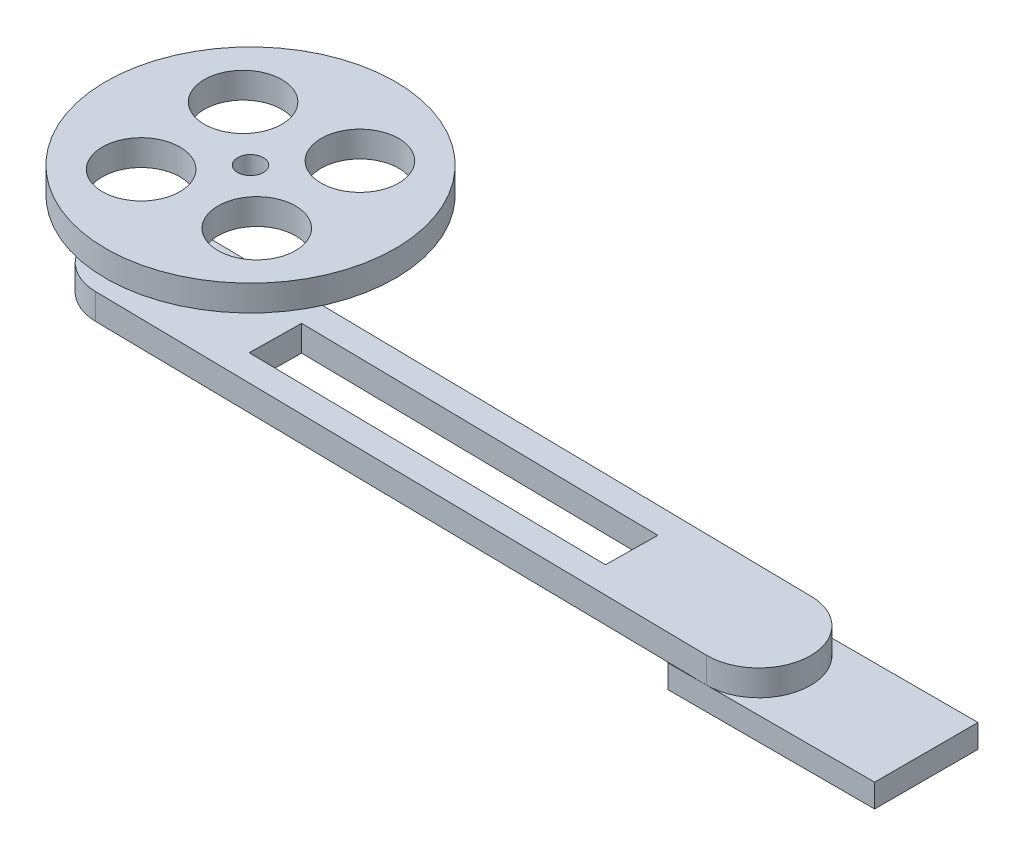
ISO-10303-21;
HEADER;
FILE_DESCRIPTION(('STEP AP214'),'2;1');
FILE_NAME('part.step','',(''),(''),'','','');
FILE_SCHEMA(('AUTOMOTIVE_DESIGN { 1 0 10303 214 1 1 1 1 }'));
ENDSEC;
DATA;
#1=APPLICATION_CONTEXT('core data for automotive mechanical design processes');
#2=APPLICATION_PROTOCOL_DEFINITION('international standard','automotive_design',2000,#1);
#3=PRODUCT_CONTEXT('',#1,'mechanical');
#4=PRODUCT('Part','Part','',(#3));
#5=PRODUCT_RELATED_PRODUCT_CATEGORY('part','',(#4));
#6=PRODUCT_DEFINITION_FORMATION('','',#4);
#7=PRODUCT_DEFINITION_CONTEXT('part definition',#1,'design');
#8=PRODUCT_DEFINITION('design','',#6,#7);
#9=PRODUCT_DEFINITION_SHAPE('','',#8);
#10=(LENGTH_UNIT() NAMED_UNIT(*) SI_UNIT(.MILLI.,.METRE.));
#11=(NAMED_UNIT(*) PLANE_ANGLE_UNIT() SI_UNIT($,.RADIAN.));
#12=(NAMED_UNIT(*) SI_UNIT($,.STERADIAN.) SOLID_ANGLE_UNIT());
#13=UNCERTAINTY_MEASURE_WITH_UNIT(LENGTH_MEASURE(1.E-05),#10,'distance_accuracy_value','');
#14=(GEOMETRIC_REPRESENTATION_CONTEXT(3) GLOBAL_UNCERTAINTY_ASSIGNED_CONTEXT((#13)) GLOBAL_UNIT_ASSIGNED_CONTEXT((#10,
#11,#12)) REPRESENTATION_CONTEXT('',''));
#15=CARTESIAN_POINT('',(0.,0.,0.));
#16=DIRECTION('',(0.,0.,1.));
#17=DIRECTION('',(1.,0.,0.));
#18=AXIS2_PLACEMENT_3D('',#15,#16,#17);
#19=CARTESIAN_POINT('',(60.1380302390525,-11.5,7.09607487118601));
#20=DIRECTION('',(0.,-1.,0.));
#21=DIRECTION('',(0.015286909378326,0.,-0.999883148373678));
#22=AXIS2_PLACEMENT_3D('',#19,#20,#21);
#23=PLANE('',#22);
#24=CARTESIAN_POINT('',(121.381030944891,-11.5,23.0234873070011));
#25=DIRECTION('',(0.,-1.,0.));
#26=DIRECTION('',(0.015286909378326,0.,-0.999883148373678));
#27=AXIS2_PLACEMENT_3D('',#24,#25,#26);
#28=CIRCLE('',#27,5.);
#29=CARTESIAN_POINT('',(121.457465491783,-11.5,18.0240715651327));
#30=VERTEX_POINT('',#29);
#31=EDGE_CURVE('P0_E11',#30,#30,#28,.T.);
#32=ORIENTED_EDGE('',*,*,#31,.T.);
#33=EDGE_LOOP('',(#32));
#34=FACE_BOUND('',#33,.T.);
#35=ADVANCED_FACE('P0_F17',(#34),#23,.T.);
#36=CARTESIAN_POINT('',(121.381030944891,-11.5,23.0234873070011));
#37=DIRECTION('',(0.,1.,0.));
#38=DIRECTION('',(-0.015286909378326,0.,0.999883148373678));
#39=AXIS2_PLACEMENT_3D('',#36,#37,#38);
#40=CYLINDRICAL_SURFACE('',#39,5.);
#41=ORIENTED_EDGE('',*,*,#31,.F.);
#42=EDGE_LOOP('',(#41));
#43=FACE_BOUND('',#42,.T.);
#44=CARTESIAN_POINT('',(121.381030944891,-6.5,23.0234873070011));
#45=DIRECTION('',(0.,-1.,0.));
#46=DIRECTION('',(0.015286909378326,0.,-0.999883148373678));
#47=AXIS2_PLACEMENT_3D('',#44,#45,#46);
#48=CIRCLE('',#47,5.);
#49=CARTESIAN_POINT('',(121.457465491783,-6.5,18.0240715651327));
#50=VERTEX_POINT('',#49);
#51=EDGE_CURVE('P0_E28',#50,#50,#48,.T.);
#52=ORIENTED_EDGE('',*,*,#51,.T.);
#53=EDGE_LOOP('',(#52));
#54=FACE_BOUND('',#53,.T.);
#55=ADVANCED_FACE('P0_F262',(#43,#54),#40,.T.);
#56=CARTESIAN_POINT('',(60.1380302390525,-1.5,7.09607487118601));
#57=DIRECTION('',(0.,-1.,0.));
#58=DIRECTION('',(0.015286909378326,0.,-0.999883148373678));
#59=AXIS2_PLACEMENT_3D('',#56,#57,#58);
#60=PLANE('',#59);
#61=CARTESIAN_POINT('',(1.39505314004968,-1.5,21.1890581816019));
#62=DIRECTION('',(0.,-1.,0.));
#63=DIRECTION('',(0.015286909378326,0.,-0.999883148373678));
#64=AXIS2_PLACEMENT_3D('',#61,#62,#63);
#65=CIRCLE('',#64,5.);
#66=CARTESIAN_POINT('',(1.47148768694131,-1.5,16.1896424397336));
#67=VERTEX_POINT('',#66);
#68=EDGE_CURVE('P0_E149',#67,#67,#65,.T.);
#69=ORIENTED_EDGE('',*,*,#68,.T.);
#70=EDGE_LOOP('',(#69));
#71=FACE_BOUND('',#70,.T.);
#72=DIRECTION('',(0.015286909378326,0.,-0.999883148373678));
#73=VECTOR('',#72,1.);
#74=CARTESIAN_POINT('',(26.3921318493917,-1.5,21.5712309160601));
#75=LINE('',#74,#73);
#76=CARTESIAN_POINT('',(26.3156973025001,-1.5,26.5706466579285));
#77=VERTEX_POINT('',#76);
#78=CARTESIAN_POINT('',(26.4685663962833,-1.5,16.5718151741917));
#79=VERTEX_POINT('',#78);
#80=EDGE_CURVE('P0_E155',#77,#79,#75,.T.);
#81=ORIENTED_EDGE('',*,*,#80,.T.);
#82=DIRECTION('',(0.999883148373678,0.,0.015286909378326));
#83=VECTOR('',#82,1.);
#84=CARTESIAN_POINT('',(61.4644765893621,-1.5,17.1068570024331));
#85=LINE('',#84,#83);
#86=CARTESIAN_POINT('',(96.4603867824408,-1.5,17.6418988306746));
#87=VERTEX_POINT('',#86);
#88=EDGE_CURVE('P0_E187',#79,#87,#85,.T.);
#89=ORIENTED_EDGE('',*,*,#88,.T.);
#90=DIRECTION('',(0.015286909378326,0.,-0.999883148373678));
#91=VECTOR('',#90,1.);
#92=CARTESIAN_POINT('',(96.3839522355492,-1.5,22.6413145725429));
#93=LINE('',#92,#91);
#94=CARTESIAN_POINT('',(96.3075176886576,-1.5,27.6407303144113));
#95=VERTEX_POINT('',#94);
#96=EDGE_CURVE('P0_E161',#95,#87,#93,.T.);
#97=ORIENTED_EDGE('',*,*,#96,.F.);
#98=DIRECTION('',(0.999883148373678,0.,0.015286909378326));
#99=VECTOR('',#98,1.);
#100=CARTESIAN_POINT('',(61.3116074955788,-1.5,27.1056884861699));
#101=LINE('',#100,#99);
#102=EDGE_CURVE('P0_E174',#77,#95,#101,.T.);
#103=ORIENTED_EDGE('',*,*,#102,.F.);
#104=EDGE_LOOP('',(#81,#89,#97,#103));
#105=FACE_BOUND('',#104,.T.);
#106=CARTESIAN_POINT('',(1.39505314004968,-1.5,21.1890581816019));
#107=DIRECTION('',(0.,1.,0.));
#108=DIRECTION('',(0.015286909378326,0.,-0.999883148373678));
#109=AXIS2_PLACEMENT_3D('',#106,#107,#108);
#110=CIRCLE('',#109,10.);
#111=CARTESIAN_POINT('',(1.54792223383294,-1.5,11.1902266978652));
#112=VERTEX_POINT('',#111);
#113=CARTESIAN_POINT('',(1.24218404626642,-1.5,31.1878896653387));
#114=VERTEX_POINT('',#113);
#115=EDGE_CURVE('P0_E118',#112,#114,#110,.T.);
#116=ORIENTED_EDGE('',*,*,#115,.T.);
#117=DIRECTION('',(0.999883148373678,0.,0.015286909378326));
#118=VECTOR('',#117,1.);
#119=CARTESIAN_POINT('',(61.2351729486872,-1.5,32.1051042280383));
#120=LINE('',#119,#118);
#121=CARTESIAN_POINT('',(121.228161851108,-1.5,33.0223187907378));
#122=VERTEX_POINT('',#121);
#123=EDGE_CURVE('P0_E111',#114,#122,#120,.T.);
#124=ORIENTED_EDGE('',*,*,#123,.T.);
#125=CARTESIAN_POINT('',(121.381030944891,-1.5,23.0234873070011));
#126=DIRECTION('',(0.,-1.,0.));
#127=DIRECTION('',(0.015286909378326,0.,-0.999883148373678));
#128=AXIS2_PLACEMENT_3D('',#125,#126,#127);
#129=CIRCLE('',#128,10.);
#130=CARTESIAN_POINT('',(121.533900038675,-1.5,13.0246558232643));
#131=VERTEX_POINT('',#130);
#132=EDGE_CURVE('P0_E115',#131,#122,#129,.T.);
#133=ORIENTED_EDGE('',*,*,#132,.F.);
#134=DIRECTION('',(0.999883148373678,0.,0.0152869093783258));
#135=VECTOR('',#134,1.);
#136=CARTESIAN_POINT('',(61.5409111362537,-1.5,12.1074412605647));
#137=LINE('',#136,#135);
#138=EDGE_CURVE('P0_E164',#112,#131,#137,.T.);
#139=ORIENTED_EDGE('',*,*,#138,.F.);
#140=EDGE_LOOP('',(#116,#124,#133,#139));
#141=FACE_BOUND('',#140,.T.);
#142=ADVANCED_FACE('P0_F113',(#71,#105,#141),#60,.F.);
#143=CARTESIAN_POINT('',(60.1380302390525,-6.5,7.09607487118601));
#144=DIRECTION('',(0.,-1.,0.));
#145=DIRECTION('',(0.015286909378326,0.,-0.999883148373678));
#146=AXIS2_PLACEMENT_3D('',#143,#144,#145);
#147=PLANE('',#146);
#148=CARTESIAN_POINT('',(1.39505314004968,-6.5,21.1890581816019));
#149=DIRECTION('',(0.,-1.,0.));
#150=DIRECTION('',(0.015286909378326,0.,-0.999883148373678));
#151=AXIS2_PLACEMENT_3D('',#148,#149,#150);
#152=CIRCLE('',#151,5.);
#153=CARTESIAN_POINT('',(1.47148768694131,-6.5,16.1896424397336));
#154=VERTEX_POINT('',#153);
#155=EDGE_CURVE('P0_E147',#154,#154,#152,.T.);
#156=ORIENTED_EDGE('',*,*,#155,.F.);
#157=EDGE_LOOP('',(#156));
#158=FACE_BOUND('',#157,.T.);
#159=ORIENTED_EDGE('',*,*,#51,.F.);
#160=EDGE_LOOP('',(#159));
#161=FACE_BOUND('',#160,.T.);
#162=DIRECTION('',(0.015286909378326,0.,-0.999883148373678));
#163=VECTOR('',#162,1.);
#164=CARTESIAN_POINT('',(26.3921318493917,-6.5,21.5712309160601));
#165=LINE('',#164,#163);
#166=CARTESIAN_POINT('',(26.3156973025001,-6.5,26.5706466579285));
#167=VERTEX_POINT('',#166);
#168=CARTESIAN_POINT('',(26.4685663962833,-6.5,16.5718151741917));
#169=VERTEX_POINT('',#168);
#170=EDGE_CURVE('P0_E154',#167,#169,#165,.T.);
#171=ORIENTED_EDGE('',*,*,#170,.F.);
#172=DIRECTION('',(0.999883148373678,0.,0.015286909378326));
#173=VECTOR('',#172,1.);
#174=CARTESIAN_POINT('',(61.3116074955788,-6.5,27.1056884861699));
#175=LINE('',#174,#173);
#176=CARTESIAN_POINT('',(96.3075176886576,-6.5,27.6407303144113));
#177=VERTEX_POINT('',#176);
#178=EDGE_CURVE('P0_E173',#167,#177,#175,.T.);
#179=ORIENTED_EDGE('',*,*,#178,.T.);
#180=DIRECTION('',(0.015286909378326,0.,-0.999883148373678));
#181=VECTOR('',#180,1.);
#182=CARTESIAN_POINT('',(96.3839522355492,-6.5,22.6413145725429));
#183=LINE('',#182,#181);
#184=CARTESIAN_POINT('',(96.4603867824408,-6.5,17.6418988306746));
#185=VERTEX_POINT('',#184);
#186=EDGE_CURVE('P0_E160',#177,#185,#183,.T.);
#187=ORIENTED_EDGE('',*,*,#186,.T.);
#188=DIRECTION('',(0.999883148373678,0.,0.015286909378326));
#189=VECTOR('',#188,1.);
#190=CARTESIAN_POINT('',(61.4644765893621,-6.5,17.1068570024331));
#191=LINE('',#190,#189);
#192=EDGE_CURVE('P0_E124',#169,#185,#191,.T.);
#193=ORIENTED_EDGE('',*,*,#192,.F.);
#194=EDGE_LOOP('',(#171,#179,#187,#193));
#195=FACE_BOUND('',#194,.T.);
#196=CARTESIAN_POINT('',(1.39505314004968,-6.5,21.1890581816019));
#197=DIRECTION('',(0.,1.,0.));
#198=DIRECTION('',(0.015286909378326,0.,-0.999883148373678));
#199=AXIS2_PLACEMENT_3D('',#196,#197,#198);
#200=CIRCLE('',#199,10.);
#201=CARTESIAN_POINT('',(1.54792223383294,-6.5,11.1902266978652));
#202=VERTEX_POINT('',#201);
#203=CARTESIAN_POINT('',(1.24218404626642,-6.5,31.1878896653387));
#204=VERTEX_POINT('',#203);
#205=EDGE_CURVE('P0_E168',#202,#204,#200,.T.);
#206=ORIENTED_EDGE('',*,*,#205,.F.);
#207=DIRECTION('',(0.999883148373678,0.,0.0152869093783258));
#208=VECTOR('',#207,1.);
#209=CARTESIAN_POINT('',(61.5409111362537,-6.5,12.1074412605647));
#210=LINE('',#209,#208);
#211=CARTESIAN_POINT('',(121.533900038675,-6.5,13.0246558232643));
#212=VERTEX_POINT('',#211);
#213=EDGE_CURVE('P0_E139',#202,#212,#210,.T.);
#214=ORIENTED_EDGE('',*,*,#213,.T.);
#215=CARTESIAN_POINT('',(121.381030944891,-6.5,23.0234873070011));
#216=DIRECTION('',(0.,-1.,0.));
#217=DIRECTION('',(0.015286909378326,0.,-0.999883148373678));
#218=AXIS2_PLACEMENT_3D('',#215,#216,#217);
#219=CIRCLE('',#218,10.);
#220=CARTESIAN_POINT('',(121.228161851108,-6.5,33.0223187907378));
#221=VERTEX_POINT('',#220);
#222=EDGE_CURVE('P0_E132',#212,#221,#219,.T.);
#223=ORIENTED_EDGE('',*,*,#222,.T.);
#224=DIRECTION('',(0.999883148373678,0.,0.015286909378326));
#225=VECTOR('',#224,1.);
#226=CARTESIAN_POINT('',(61.2351729486872,-6.5,32.1051042280383));
#227=LINE('',#226,#225);
#228=EDGE_CURVE('P0_E123',#204,#221,#227,.T.);
#229=ORIENTED_EDGE('',*,*,#228,.F.);
#230=EDGE_LOOP('',(#206,#214,#223,#229));
#231=FACE_BOUND('',#230,.T.);
#232=ADVANCED_FACE('P0_F223',(#158,#161,#195,#231),#147,.T.);
#233=CARTESIAN_POINT('',(1.39505314004968,-6.5,21.1890581816019));
#234=DIRECTION('',(0.,1.,0.));
#235=DIRECTION('',(-0.015286909378326,0.,0.999883148373678));
#236=AXIS2_PLACEMENT_3D('',#233,#234,#235);
#237=CYLINDRICAL_SURFACE('',#236,5.);
#238=ORIENTED_EDGE('',*,*,#68,.F.);
#239=EDGE_LOOP('',(#238));
#240=FACE_BOUND('',#239,.T.);
#241=ORIENTED_EDGE('',*,*,#155,.T.);
#242=EDGE_LOOP('',(#241));
#243=FACE_BOUND('',#242,.T.);
#244=ADVANCED_FACE('P0_F228',(#240,#243),#237,.F.);
#245=CARTESIAN_POINT('',(61.2351729486872,-6.5,32.1051042280383));
#246=DIRECTION('',(-0.015286909378326,0.,0.999883148373678));
#247=DIRECTION('',(0.999883148373678,0.,0.015286909378326));
#248=AXIS2_PLACEMENT_3D('',#245,#246,#247);
#249=PLANE('',#248);
#250=ORIENTED_EDGE('',*,*,#123,.F.);
#251=DIRECTION('',(0.,1.,0.));
#252=VECTOR('',#251,1.);
#253=CARTESIAN_POINT('',(1.24218404626642,-6.5,31.1878896653387));
#254=LINE('',#253,#252);
#255=EDGE_CURVE('P0_E165',#204,#114,#254,.T.);
#256=ORIENTED_EDGE('',*,*,#255,.F.);
#257=ORIENTED_EDGE('',*,*,#228,.T.);
#258=DIRECTION('',(0.,1.,0.));
#259=VECTOR('',#258,1.);
#260=CARTESIAN_POINT('',(121.228161851108,-6.5,33.0223187907378));
#261=LINE('',#260,#259);
#262=EDGE_CURVE('P0_E127',#221,#122,#261,.T.);
#263=ORIENTED_EDGE('',*,*,#262,.T.);
#264=EDGE_LOOP('',(#250,#256,#257,#263));
#265=FACE_BOUND('',#264,.T.);
#266=ADVANCED_FACE('P0_F128',(#265),#249,.T.);
#267=CARTESIAN_POINT('',(61.4644765893621,-6.5,17.1068570024331));
#268=DIRECTION('',(-0.015286909378326,0.,0.999883148373678));
#269=DIRECTION('',(0.999883148373678,0.,0.015286909378326));
#270=AXIS2_PLACEMENT_3D('',#267,#268,#269);
#271=PLANE('',#270);
#272=ORIENTED_EDGE('',*,*,#88,.F.);
#273=DIRECTION('',(0.,1.,0.));
#274=VECTOR('',#273,1.);
#275=CARTESIAN_POINT('',(26.4685663962833,-6.5,16.5718151741917));
#276=LINE('',#275,#274);
#277=EDGE_CURVE('P0_E178',#169,#79,#276,.T.);
#278=ORIENTED_EDGE('',*,*,#277,.F.);
#279=ORIENTED_EDGE('',*,*,#192,.T.);
#280=DIRECTION('',(0.,1.,0.));
#281=VECTOR('',#280,1.);
#282=CARTESIAN_POINT('',(96.4603867824408,-6.5,17.6418988306746));
#283=LINE('',#282,#281);
#284=EDGE_CURVE('P0_E156',#185,#87,#283,.T.);
#285=ORIENTED_EDGE('',*,*,#284,.T.);
#286=EDGE_LOOP('',(#272,#278,#279,#285));
#287=FACE_BOUND('',#286,.T.);
#288=ADVANCED_FACE('P0_F274',(#287),#271,.T.);
#289=CARTESIAN_POINT('',(121.381030944891,-6.5,23.0234873070011));
#290=DIRECTION('',(0.,1.,0.));
#291=DIRECTION('',(-0.015286909378326,0.,0.999883148373678));
#292=AXIS2_PLACEMENT_3D('',#289,#290,#291);
#293=CYLINDRICAL_SURFACE('',#292,10.);
#294=ORIENTED_EDGE('',*,*,#132,.T.);
#295=ORIENTED_EDGE('',*,*,#262,.F.);
#296=ORIENTED_EDGE('',*,*,#222,.F.);
#297=DIRECTION('',(0.,1.,0.));
#298=VECTOR('',#297,1.);
#299=CARTESIAN_POINT('',(121.533900038675,-6.5,13.0246558232643));
#300=LINE('',#299,#298);
#301=EDGE_CURVE('P0_E136',#212,#131,#300,.T.);
#302=ORIENTED_EDGE('',*,*,#301,.T.);
#303=EDGE_LOOP('',(#294,#295,#296,#302));
#304=FACE_BOUND('',#303,.T.);
#305=ADVANCED_FACE('P0_F134',(#304),#293,.T.);
#306=CARTESIAN_POINT('',(61.5409111362537,-6.5,12.1074412605647));
#307=DIRECTION('',(-0.0152869093783258,0.,0.999883148373678));
#308=DIRECTION('',(0.999883148373678,0.,0.0152869093783258));
#309=AXIS2_PLACEMENT_3D('',#306,#307,#308);
#310=PLANE('',#309);
#311=ORIENTED_EDGE('',*,*,#138,.T.);
#312=ORIENTED_EDGE('',*,*,#301,.F.);
#313=ORIENTED_EDGE('',*,*,#213,.F.);
#314=DIRECTION('',(0.,1.,0.));
#315=VECTOR('',#314,1.);
#316=CARTESIAN_POINT('',(1.54792223383294,-6.5,11.1902266978652));
#317=LINE('',#316,#315);
#318=EDGE_CURVE('P0_E21',#202,#112,#317,.T.);
#319=ORIENTED_EDGE('',*,*,#318,.T.);
#320=EDGE_LOOP('',(#311,#312,#313,#319));
#321=FACE_BOUND('',#320,.T.);
#322=ADVANCED_FACE('P0_F273',(#321),#310,.F.);
#323=CARTESIAN_POINT('',(1.39505314004968,-6.5,21.1890581816019));
#324=DIRECTION('',(0.,1.,0.));
#325=DIRECTION('',(-0.015286909378326,0.,0.999883148373678));
#326=AXIS2_PLACEMENT_3D('',#323,#324,#325);
#327=CYLINDRICAL_SURFACE('',#326,10.);
#328=ORIENTED_EDGE('',*,*,#115,.F.);
#329=ORIENTED_EDGE('',*,*,#318,.F.);
#330=ORIENTED_EDGE('',*,*,#205,.T.);
#331=ORIENTED_EDGE('',*,*,#255,.T.);
#332=EDGE_LOOP('',(#328,#329,#330,#331));
#333=FACE_BOUND('',#332,.T.);
#334=ADVANCED_FACE('P0_F19',(#333),#327,.T.);
#335=CARTESIAN_POINT('',(96.3839522355492,-6.5,22.6413145725429));
#336=DIRECTION('',(0.999883148373678,0.,0.015286909378326));
#337=DIRECTION('',(0.,1.,0.));
#338=AXIS2_PLACEMENT_3D('',#335,#336,#337);
#339=PLANE('',#338);
#340=ORIENTED_EDGE('',*,*,#96,.T.);
#341=ORIENTED_EDGE('',*,*,#284,.F.);
#342=ORIENTED_EDGE('',*,*,#186,.F.);
#343=DIRECTION('',(0.,1.,0.));
#344=VECTOR('',#343,1.);
#345=CARTESIAN_POINT('',(96.3075176886576,-6.5,27.6407303144113));
#346=LINE('',#345,#344);
#347=EDGE_CURVE('P0_E169',#177,#95,#346,.T.);
#348=ORIENTED_EDGE('',*,*,#347,.T.);
#349=EDGE_LOOP('',(#340,#341,#342,#348));
#350=FACE_BOUND('',#349,.T.);
#351=ADVANCED_FACE('P0_F243',(#350),#339,.F.);
#352=CARTESIAN_POINT('',(61.3116074955788,-6.5,27.1056884861699));
#353=DIRECTION('',(-0.015286909378326,0.,0.999883148373678));
#354=DIRECTION('',(0.999883148373678,0.,0.015286909378326));
#355=AXIS2_PLACEMENT_3D('',#352,#353,#354);
#356=PLANE('',#355);
#357=ORIENTED_EDGE('',*,*,#102,.T.);
#358=ORIENTED_EDGE('',*,*,#347,.F.);
#359=ORIENTED_EDGE('',*,*,#178,.F.);
#360=DIRECTION('',(0.,1.,0.));
#361=VECTOR('',#360,1.);
#362=CARTESIAN_POINT('',(26.3156973025001,-6.5,26.5706466579285));
#363=LINE('',#362,#361);
#364=EDGE_CURVE('P0_E150',#167,#77,#363,.T.);
#365=ORIENTED_EDGE('',*,*,#364,.T.);
#366=EDGE_LOOP('',(#357,#358,#359,#365));
#367=FACE_BOUND('',#366,.T.);
#368=ADVANCED_FACE('P0_F237',(#367),#356,.F.);
#369=CARTESIAN_POINT('',(26.3921318493917,-6.5,21.5712309160601));
#370=DIRECTION('',(0.999883148373678,0.,0.015286909378326));
#371=DIRECTION('',(0.,1.,0.));
#372=AXIS2_PLACEMENT_3D('',#369,#370,#371);
#373=PLANE('',#372);
#374=ORIENTED_EDGE('',*,*,#80,.F.);
#375=ORIENTED_EDGE('',*,*,#364,.F.);
#376=ORIENTED_EDGE('',*,*,#170,.T.);
#377=ORIENTED_EDGE('',*,*,#277,.T.);
#378=EDGE_LOOP('',(#374,#375,#376,#377));
#379=FACE_BOUND('',#378,.T.);
#380=ADVANCED_FACE('P0_F242',(#379),#373,.T.);
#381=CLOSED_SHELL('',(#35,#55,#142,#232,#244,#266,#288,#305,#322,#334,#351,#368,#380));
#382=MANIFOLD_SOLID_BREP('P0_B1',#381);
#383=CARTESIAN_POINT('',(0.,3.5,0.));
#384=DIRECTION('',(0.,-1.,0.));
#385=DIRECTION('',(-0.753173889661564,0.,-0.657821474210192));
#386=AXIS2_PLACEMENT_3D('',#383,#384,#385);
#387=PLANE('',#386);
#388=CARTESIAN_POINT('',(0.,3.5,0.));
#389=DIRECTION('',(0.,-1.,0.));
#390=DIRECTION('',(-0.753173889661564,0.,-0.657821474210192));
#391=AXIS2_PLACEMENT_3D('',#388,#389,#390);
#392=CIRCLE('',#391,28.);
#393=CARTESIAN_POINT('',(-21.0888689105238,3.5,-18.4190012778854));
#394=VERTEX_POINT('',#393);
#395=EDGE_CURVE('P1_E11',#394,#394,#392,.T.);
#396=ORIENTED_EDGE('',*,*,#395,.F.);
#397=EDGE_LOOP('',(#396));
#398=FACE_BOUND('',#397,.T.);
#399=CARTESIAN_POINT('',(-9.86732211315288,3.5,11.2976083449235));
#400=DIRECTION('',(0.,-1.,0.));
#401=DIRECTION('',(-0.753173889661564,0.,-0.657821474210192));
#402=AXIS2_PLACEMENT_3D('',#399,#400,#401);
#403=CIRCLE('',#402,7.5);
#404=CARTESIAN_POINT('',(-15.5161262856146,3.5,6.36394728834702));
#405=VERTEX_POINT('',#404);
#406=EDGE_CURVE('P1_E113',#405,#405,#403,.T.);
#407=ORIENTED_EDGE('',*,*,#406,.T.);
#408=EDGE_LOOP('',(#407));
#409=FACE_BOUND('',#408,.T.);
#410=CARTESIAN_POINT('',(11.1940677571499,3.5,9.98463054140406));
#411=DIRECTION('',(0.,-1.,0.));
#412=DIRECTION('',(-0.753173889661564,0.,-0.657821474210192));
#413=AXIS2_PLACEMENT_3D('',#410,#411,#412);
#414=CIRCLE('',#413,7.5);
#415=CARTESIAN_POINT('',(5.54526358468812,3.5,5.05096948482759));
#416=VERTEX_POINT('',#415);
#417=EDGE_CURVE('P1_E20',#416,#416,#414,.T.);
#418=ORIENTED_EDGE('',*,*,#417,.T.);
#419=EDGE_LOOP('',(#418));
#420=FACE_BOUND('',#419,.T.);
#421=CARTESIAN_POINT('',(9.8593643353273,3.5,-11.3045537241978));
#422=DIRECTION('',(0.,-1.,0.));
#423=DIRECTION('',(-0.753173889661564,0.,-0.657821474210192));
#424=AXIS2_PLACEMENT_3D('',#421,#422,#423);
#425=CIRCLE('',#424,7.5);
#426=CARTESIAN_POINT('',(4.21056016286558,3.5,-16.2382147807743));
#427=VERTEX_POINT('',#426);
#428=EDGE_CURVE('P1_E91',#427,#427,#425,.T.);
#429=ORIENTED_EDGE('',*,*,#428,.T.);
#430=EDGE_LOOP('',(#429));
#431=FACE_BOUND('',#430,.T.);
#432=CARTESIAN_POINT('',(-11.3017372348726,3.5,-9.86259273588312));
#433=DIRECTION('',(0.,-1.,0.));
#434=DIRECTION('',(-0.753173889661564,0.,-0.657821474210192));
#435=AXIS2_PLACEMENT_3D('',#432,#433,#434);
#436=CIRCLE('',#435,7.5);
#437=CARTESIAN_POINT('',(-16.9505414073343,3.5,-14.7962537924596));
#438=VERTEX_POINT('',#437);
#439=EDGE_CURVE('P1_E101',#438,#438,#436,.T.);
#440=ORIENTED_EDGE('',*,*,#439,.T.);
#441=EDGE_LOOP('',(#440));
#442=FACE_BOUND('',#441,.T.);
#443=CARTESIAN_POINT('',(0.,3.5,0.));
#444=DIRECTION('',(0.,-1.,0.));
#445=DIRECTION('',(-0.753173889661564,0.,-0.657821474210192));
#446=AXIS2_PLACEMENT_3D('',#443,#444,#445);
#447=CIRCLE('',#446,2.5);
#448=CARTESIAN_POINT('',(-1.88293472415391,3.5,-1.64455368552548));
#449=VERTEX_POINT('',#448);
#450=EDGE_CURVE('P1_E69',#449,#449,#447,.T.);
#451=ORIENTED_EDGE('',*,*,#450,.T.);
#452=EDGE_LOOP('',(#451));
#453=FACE_BOUND('',#452,.T.);
#454=ADVANCED_FACE('P1_F17',(#398,#409,#420,#431,#442,#453),#387,.F.);
#455=CARTESIAN_POINT('',(0.,-1.5,0.));
#456=DIRECTION('',(0.,-1.,0.));
#457=DIRECTION('',(-0.753173889661564,0.,-0.657821474210192));
#458=AXIS2_PLACEMENT_3D('',#455,#456,#457);
#459=PLANE('',#458);
#460=CARTESIAN_POINT('',(0.,-1.5,0.));
#461=DIRECTION('',(0.,-1.,0.));
#462=DIRECTION('',(-0.753173889661564,0.,-0.657821474210192));
#463=AXIS2_PLACEMENT_3D('',#460,#461,#462);
#464=CIRCLE('',#463,28.);
#465=CARTESIAN_POINT('',(-21.0888689105238,-1.5,-18.4190012778854));
#466=VERTEX_POINT('',#465);
#467=EDGE_CURVE('P1_E27',#466,#466,#464,.T.);
#468=ORIENTED_EDGE('',*,*,#467,.T.);
#469=EDGE_LOOP('',(#468));
#470=FACE_BOUND('',#469,.T.);
#471=CARTESIAN_POINT('',(-9.86732211315288,-1.5,11.2976083449235));
#472=DIRECTION('',(0.,-1.,0.));
#473=DIRECTION('',(-0.753173889661564,0.,-0.657821474210192));
#474=AXIS2_PLACEMENT_3D('',#471,#472,#473);
#475=CIRCLE('',#474,7.5);
#476=CARTESIAN_POINT('',(-15.5161262856146,-1.5,6.36394728834702));
#477=VERTEX_POINT('',#476);
#478=EDGE_CURVE('P1_E110',#477,#477,#475,.T.);
#479=ORIENTED_EDGE('',*,*,#478,.F.);
#480=EDGE_LOOP('',(#479));
#481=FACE_BOUND('',#480,.T.);
#482=CARTESIAN_POINT('',(11.1940677571499,-1.5,9.98463054140406));
#483=DIRECTION('',(0.,-1.,0.));
#484=DIRECTION('',(-0.753173889661564,0.,-0.657821474210192));
#485=AXIS2_PLACEMENT_3D('',#482,#483,#484);
#486=CIRCLE('',#485,7.5);
#487=CARTESIAN_POINT('',(5.54526358468812,-1.5,5.05096948482759));
#488=VERTEX_POINT('',#487);
#489=EDGE_CURVE('P1_E130',#488,#488,#486,.T.);
#490=ORIENTED_EDGE('',*,*,#489,.F.);
#491=EDGE_LOOP('',(#490));
#492=FACE_BOUND('',#491,.T.);
#493=CARTESIAN_POINT('',(9.8593643353273,-1.5,-11.3045537241978));
#494=DIRECTION('',(0.,-1.,0.));
#495=DIRECTION('',(-0.753173889661564,0.,-0.657821474210192));
#496=AXIS2_PLACEMENT_3D('',#493,#494,#495);
#497=CIRCLE('',#496,7.5);
#498=CARTESIAN_POINT('',(4.21056016286558,-1.5,-16.2382147807743));
#499=VERTEX_POINT('',#498);
#500=EDGE_CURVE('P1_E96',#499,#499,#497,.T.);
#501=ORIENTED_EDGE('',*,*,#500,.F.);
#502=EDGE_LOOP('',(#501));
#503=FACE_BOUND('',#502,.T.);
#504=CARTESIAN_POINT('',(-11.3017372348726,-1.5,-9.86259273588312));
#505=DIRECTION('',(0.,-1.,0.));
#506=DIRECTION('',(-0.753173889661564,0.,-0.657821474210192));
#507=AXIS2_PLACEMENT_3D('',#504,#505,#506);
#508=CIRCLE('',#507,7.5);
#509=CARTESIAN_POINT('',(-16.9505414073343,-1.5,-14.7962537924596));
#510=VERTEX_POINT('',#509);
#511=EDGE_CURVE('P1_E95',#510,#510,#508,.T.);
#512=ORIENTED_EDGE('',*,*,#511,.F.);
#513=EDGE_LOOP('',(#512));
#514=FACE_BOUND('',#513,.T.);
#515=CARTESIAN_POINT('',(1.39505314004839,-1.5,21.1890581816022));
#516=DIRECTION('',(0.,-1.,0.));
#517=DIRECTION('',(-0.753173889661564,0.,-0.657821474210192));
#518=AXIS2_PLACEMENT_3D('',#515,#516,#517);
#519=CIRCLE('',#518,5.);
#520=CARTESIAN_POINT('',(-2.37081630825939,-1.5,17.8999508105512));
#521=VERTEX_POINT('',#520);
#522=EDGE_CURVE('P1_E116',#521,#521,#519,.T.);
#523=ORIENTED_EDGE('',*,*,#522,.F.);
#524=EDGE_LOOP('',(#523));
#525=FACE_BOUND('',#524,.T.);
#526=CARTESIAN_POINT('',(0.,-1.5,0.));
#527=DIRECTION('',(0.,-1.,0.));
#528=DIRECTION('',(-0.753173889661564,0.,-0.657821474210192));
#529=AXIS2_PLACEMENT_3D('',#526,#527,#528);
#530=CIRCLE('',#529,2.5);
#531=CARTESIAN_POINT('',(-1.88293472415391,-1.5,-1.64455368552548));
#532=VERTEX_POINT('',#531);
#533=EDGE_CURVE('P1_E78',#532,#532,#530,.T.);
#534=ORIENTED_EDGE('',*,*,#533,.F.);
#535=EDGE_LOOP('',(#534));
#536=FACE_BOUND('',#535,.T.);
#537=ADVANCED_FACE('P1_F149',(#470,#481,#492,#503,#514,#525,#536),#459,.T.);
#538=CARTESIAN_POINT('',(0.,-1.5,0.));
#539=DIRECTION('',(0.,1.,0.));
#540=DIRECTION('',(0.753173889661564,0.,0.657821474210192));
#541=AXIS2_PLACEMENT_3D('',#538,#539,#540);
#542=CYLINDRICAL_SURFACE('',#541,28.);
#543=ORIENTED_EDGE('',*,*,#395,.T.);
#544=EDGE_LOOP('',(#543));
#545=FACE_BOUND('',#544,.T.);
#546=ORIENTED_EDGE('',*,*,#467,.F.);
#547=EDGE_LOOP('',(#546));
#548=FACE_BOUND('',#547,.T.);
#549=ADVANCED_FACE('P1_F152',(#545,#548),#542,.T.);
#550=CARTESIAN_POINT('',(0.,-1.5,0.));
#551=DIRECTION('',(0.,1.,0.));
#552=DIRECTION('',(0.753173889661564,0.,0.657821474210192));
#553=AXIS2_PLACEMENT_3D('',#550,#551,#552);
#554=CYLINDRICAL_SURFACE('',#553,2.5);
#555=ORIENTED_EDGE('',*,*,#450,.F.);
#556=EDGE_LOOP('',(#555));
#557=FACE_BOUND('',#556,.T.);
#558=ORIENTED_EDGE('',*,*,#533,.T.);
#559=EDGE_LOOP('',(#558));
#560=FACE_BOUND('',#559,.T.);
#561=ADVANCED_FACE('P1_F166',(#557,#560),#554,.F.);
#562=CARTESIAN_POINT('',(-11.3017372348726,-1.5,-9.86259273588312));
#563=DIRECTION('',(0.,1.,0.));
#564=DIRECTION('',(0.753173889661564,0.,0.657821474210192));
#565=AXIS2_PLACEMENT_3D('',#562,#563,#564);
#566=CYLINDRICAL_SURFACE('',#565,7.5);
#567=ORIENTED_EDGE('',*,*,#439,.F.);
#568=EDGE_LOOP('',(#567));
#569=FACE_BOUND('',#568,.T.);
#570=ORIENTED_EDGE('',*,*,#511,.T.);
#571=EDGE_LOOP('',(#570));
#572=FACE_BOUND('',#571,.T.);
#573=ADVANCED_FACE('P1_F163',(#569,#572),#566,.F.);
#574=CARTESIAN_POINT('',(9.8593643353273,-1.5,-11.3045537241978));
#575=DIRECTION('',(0.,1.,0.));
#576=DIRECTION('',(0.753173889661564,0.,0.657821474210192));
#577=AXIS2_PLACEMENT_3D('',#574,#575,#576);
#578=CYLINDRICAL_SURFACE('',#577,7.5);
#579=ORIENTED_EDGE('',*,*,#428,.F.);
#580=EDGE_LOOP('',(#579));
#581=FACE_BOUND('',#580,.T.);
#582=ORIENTED_EDGE('',*,*,#500,.T.);
#583=EDGE_LOOP('',(#582));
#584=FACE_BOUND('',#583,.T.);
#585=ADVANCED_FACE('P1_F165',(#581,#584),#578,.F.);
#586=CARTESIAN_POINT('',(11.1940677571499,-1.5,9.98463054140406));
#587=DIRECTION('',(0.,1.,0.));
#588=DIRECTION('',(0.753173889661564,0.,0.657821474210192));
#589=AXIS2_PLACEMENT_3D('',#586,#587,#588);
#590=CYLINDRICAL_SURFACE('',#589,7.5);
#591=ORIENTED_EDGE('',*,*,#417,.F.);
#592=EDGE_LOOP('',(#591));
#593=FACE_BOUND('',#592,.T.);
#594=ORIENTED_EDGE('',*,*,#489,.T.);
#595=EDGE_LOOP('',(#594));
#596=FACE_BOUND('',#595,.T.);
#597=ADVANCED_FACE('P1_F145',(#593,#596),#590,.F.);
#598=CARTESIAN_POINT('',(-9.86732211315288,-1.5,11.2976083449235));
#599=DIRECTION('',(0.,1.,0.));
#600=DIRECTION('',(0.753173889661564,0.,0.657821474210192));
#601=AXIS2_PLACEMENT_3D('',#598,#599,#600);
#602=CYLINDRICAL_SURFACE('',#601,7.5);
#603=ORIENTED_EDGE('',*,*,#406,.F.);
#604=EDGE_LOOP('',(#603));
#605=FACE_BOUND('',#604,.T.);
#606=ORIENTED_EDGE('',*,*,#478,.T.);
#607=EDGE_LOOP('',(#606));
#608=FACE_BOUND('',#607,.T.);
#609=ADVANCED_FACE('P1_F141',(#605,#608),#602,.F.);
#610=CARTESIAN_POINT('',(0.,-6.5,0.));
#611=DIRECTION('',(0.,-1.,0.));
#612=DIRECTION('',(-0.753173889661564,0.,-0.657821474210192));
#613=AXIS2_PLACEMENT_3D('',#610,#611,#612);
#614=PLANE('',#613);
#615=CARTESIAN_POINT('',(1.39505314004839,-6.5,21.1890581816022));
#616=DIRECTION('',(0.,-1.,0.));
#617=DIRECTION('',(-0.753173889661564,0.,-0.657821474210192));
#618=AXIS2_PLACEMENT_3D('',#615,#616,#617);
#619=CIRCLE('',#618,5.);
#620=CARTESIAN_POINT('',(-2.37081630825939,-6.5,17.8999508105512));
#621=VERTEX_POINT('',#620);
#622=EDGE_CURVE('P1_E114',#621,#621,#619,.T.);
#623=ORIENTED_EDGE('',*,*,#622,.T.);
#624=EDGE_LOOP('',(#623));
#625=FACE_BOUND('',#624,.T.);
#626=ADVANCED_FACE('P1_F144',(#625),#614,.T.);
#627=CARTESIAN_POINT('',(1.39505314004839,-6.5,21.1890581816022));
#628=DIRECTION('',(0.,1.,0.));
#629=DIRECTION('',(0.753173889661564,0.,0.657821474210192));
#630=AXIS2_PLACEMENT_3D('',#627,#628,#629);
#631=CYLINDRICAL_SURFACE('',#630,5.);
#632=ORIENTED_EDGE('',*,*,#622,.F.);
#633=EDGE_LOOP('',(#632));
#634=FACE_BOUND('',#633,.T.);
#635=ORIENTED_EDGE('',*,*,#522,.T.);
#636=EDGE_LOOP('',(#635));
#637=FACE_BOUND('',#636,.T.);
#638=ADVANCED_FACE('P1_F239',(#634,#637),#631,.T.);
#639=CLOSED_SHELL('',(#454,#537,#549,#561,#573,#585,#597,#609,#626,#638));
#640=MANIFOLD_SOLID_BREP('P1_B1',#639);
#641=CARTESIAN_POINT('',(0.,0.,0.));
#642=DIRECTION('',(0.,-1.,0.));
#643=DIRECTION('',(0.,0.,-1.));
#644=AXIS2_PLACEMENT_3D('',#641,#642,#643);
#645=PLANE('',#644);
#646=CARTESIAN_POINT('',(0.,0.,0.));
#647=DIRECTION('',(0.,-1.,0.));
#648=DIRECTION('',(0.,0.,-1.));
#649=AXIS2_PLACEMENT_3D('',#646,#647,#648);
#650=CIRCLE('',#649,2.5);
#651=CARTESIAN_POINT('',(0.,0.,-2.5));
#652=VERTEX_POINT('',#651);
#653=EDGE_CURVE('P2_E11',#652,#652,#650,.T.);
#654=ORIENTED_EDGE('',*,*,#653,.F.);
#655=EDGE_LOOP('',(#654));
#656=FACE_BOUND('',#655,.T.);
#657=ADVANCED_FACE('P2_F17',(#656),#645,.F.);
#658=CARTESIAN_POINT('',(0.,-1.5,0.));
#659=DIRECTION('',(0.,-1.,0.));
#660=DIRECTION('',(0.,0.,-1.));
#661=AXIS2_PLACEMENT_3D('',#658,#659,#660);
#662=PLANE('',#661);
#663=CARTESIAN_POINT('',(0.,-1.5,0.));
#664=DIRECTION('',(0.,-1.,0.));
#665=DIRECTION('',(0.,0.,-1.));
#666=AXIS2_PLACEMENT_3D('',#663,#664,#665);
#667=CIRCLE('',#666,2.5);
#668=CARTESIAN_POINT('',(0.,-1.5,-2.5));
#669=VERTEX_POINT('',#668);
#670=EDGE_CURVE('P2_E21',#669,#669,#667,.T.);
#671=ORIENTED_EDGE('',*,*,#670,.T.);
#672=EDGE_LOOP('',(#671));
#673=FACE_BOUND('',#672,.T.);
#674=ADVANCED_FACE('P2_F19',(#673),#662,.T.);
#675=CARTESIAN_POINT('',(0.,-1.5,0.));
#676=DIRECTION('',(0.,1.,0.));
#677=DIRECTION('',(0.,0.,1.));
#678=AXIS2_PLACEMENT_3D('',#675,#676,#677);
#679=CYLINDRICAL_SURFACE('',#678,2.5);
#680=ORIENTED_EDGE('',*,*,#653,.T.);
#681=EDGE_LOOP('',(#680));
#682=FACE_BOUND('',#681,.T.);
#683=ORIENTED_EDGE('',*,*,#670,.F.);
#684=EDGE_LOOP('',(#683));
#685=FACE_BOUND('',#684,.T.);
#686=ADVANCED_FACE('P2_F57',(#682,#685),#679,.T.);
#687=CLOSED_SHELL('',(#657,#674,#686));
#688=MANIFOLD_SOLID_BREP('P2_B1',#687);
#689=CARTESIAN_POINT('',(72.5817950868736,-6.5,23.023487307002));
#690=DIRECTION('',(0.,-1.,0.));
#691=DIRECTION('',(0.,0.,-1.));
#692=AXIS2_PLACEMENT_3D('',#689,#690,#691);
#693=PLANE('',#692);
#694=CARTESIAN_POINT('',(121.381030944897,-6.5,23.023487307002));
#695=DIRECTION('',(0.,-1.,0.));
#696=DIRECTION('',(0.,0.,-1.));
#697=AXIS2_PLACEMENT_3D('',#694,#695,#696);
#698=CIRCLE('',#697,5.);
#699=CARTESIAN_POINT('',(121.381030944897,-6.5,18.023487307002));
#700=VERTEX_POINT('',#699);
#701=EDGE_CURVE('P3_E11',#700,#700,#698,.T.);
#702=ORIENTED_EDGE('',*,*,#701,.T.);
#703=EDGE_LOOP('',(#702));
#704=FACE_BOUND('',#703,.T.);
#705=DIRECTION('',(1.,0.,0.));
#706=VECTOR('',#705,1.);
#707=CARTESIAN_POINT('',(133.78255922885,-6.5,33.0234873070019));
#708=LINE('',#707,#706);
#709=CARTESIAN_POINT('',(113.78255922885,-6.5,33.0234873070019));
#710=VERTEX_POINT('',#709);
#711=CARTESIAN_POINT('',(153.78255922885,-6.5,33.0234873070019));
#712=VERTEX_POINT('',#711);
#713=EDGE_CURVE('P3_E96',#710,#712,#708,.T.);
#714=ORIENTED_EDGE('',*,*,#713,.T.);
#715=DIRECTION('',(0.,0.,-1.));
#716=VECTOR('',#715,1.);
#717=CARTESIAN_POINT('',(153.78255922885,-6.5,23.023487307002));
#718=LINE('',#717,#716);
#719=CARTESIAN_POINT('',(153.78255922885,-6.5,13.023487307002));
#720=VERTEX_POINT('',#719);
#721=EDGE_CURVE('P3_E88',#712,#720,#718,.T.);
#722=ORIENTED_EDGE('',*,*,#721,.T.);
#723=DIRECTION('',(1.,0.,0.));
#724=VECTOR('',#723,1.);
#725=CARTESIAN_POINT('',(133.78255922885,-6.5,13.023487307002));
#726=LINE('',#725,#724);
#727=CARTESIAN_POINT('',(113.78255922885,-6.5,13.0234873070019));
#728=VERTEX_POINT('',#727);
#729=EDGE_CURVE('P3_E70',#728,#720,#726,.T.);
#730=ORIENTED_EDGE('',*,*,#729,.F.);
#731=DIRECTION('',(0.,0.,-1.));
#732=VECTOR('',#731,1.);
#733=CARTESIAN_POINT('',(113.78255922885,-6.5,23.023487307002));
#734=LINE('',#733,#732);
#735=EDGE_CURVE('P3_E94',#710,#728,#734,.T.);
#736=ORIENTED_EDGE('',*,*,#735,.F.);
#737=EDGE_LOOP('',(#714,#722,#730,#736));
#738=FACE_BOUND('',#737,.T.);
#739=ADVANCED_FACE('P3_F17',(#704,#738),#693,.F.);
#740=CARTESIAN_POINT('',(72.5817950868736,-11.,23.023487307002));
#741=DIRECTION('',(0.,-1.,0.));
#742=DIRECTION('',(0.,0.,-1.));
#743=AXIS2_PLACEMENT_3D('',#740,#741,#742);
#744=PLANE('',#743);
#745=CARTESIAN_POINT('',(121.381030944897,-11.,23.023487307002));
#746=DIRECTION('',(0.,-1.,0.));
#747=DIRECTION('',(0.,0.,-1.));
#748=AXIS2_PLACEMENT_3D('',#745,#746,#747);
#749=CIRCLE('',#748,5.);
#750=CARTESIAN_POINT('',(121.381030944897,-11.,18.023487307002));
#751=VERTEX_POINT('',#750);
#752=EDGE_CURVE('P3_E28',#751,#751,#749,.T.);
#753=ORIENTED_EDGE('',*,*,#752,.F.);
#754=EDGE_LOOP('',(#753));
#755=FACE_BOUND('',#754,.T.);
#756=DIRECTION('',(1.,0.,0.));
#757=VECTOR('',#756,1.);
#758=CARTESIAN_POINT('',(133.78255922885,-11.,33.0234873070019));
#759=LINE('',#758,#757);
#760=CARTESIAN_POINT('',(113.78255922885,-11.,33.0234873070019));
#761=VERTEX_POINT('',#760);
#762=CARTESIAN_POINT('',(153.78255922885,-11.,33.0234873070019));
#763=VERTEX_POINT('',#762);
#764=EDGE_CURVE('P3_E107',#761,#763,#759,.T.);
#765=ORIENTED_EDGE('',*,*,#764,.F.);
#766=DIRECTION('',(0.,0.,-1.));
#767=VECTOR('',#766,1.);
#768=CARTESIAN_POINT('',(113.78255922885,-11.,23.023487307002));
#769=LINE('',#768,#767);
#770=CARTESIAN_POINT('',(113.78255922885,-11.,13.0234873070019));
#771=VERTEX_POINT('',#770);
#772=EDGE_CURVE('P3_E21',#761,#771,#769,.T.);
#773=ORIENTED_EDGE('',*,*,#772,.T.);
#774=DIRECTION('',(1.,0.,0.));
#775=VECTOR('',#774,1.);
#776=CARTESIAN_POINT('',(133.78255922885,-11.,13.023487307002));
#777=LINE('',#776,#775);
#778=CARTESIAN_POINT('',(153.78255922885,-11.,13.023487307002));
#779=VERTEX_POINT('',#778);
#780=EDGE_CURVE('P3_E59',#771,#779,#777,.T.);
#781=ORIENTED_EDGE('',*,*,#780,.T.);
#782=DIRECTION('',(0.,0.,-1.));
#783=VECTOR('',#782,1.);
#784=CARTESIAN_POINT('',(153.78255922885,-11.,23.023487307002));
#785=LINE('',#784,#783);
#786=EDGE_CURVE('P3_E128',#763,#779,#785,.T.);
#787=ORIENTED_EDGE('',*,*,#786,.F.);
#788=EDGE_LOOP('',(#765,#773,#781,#787));
#789=FACE_BOUND('',#788,.T.);
#790=ADVANCED_FACE('P3_F143',(#755,#789),#744,.T.);
#791=CARTESIAN_POINT('',(121.381030944897,-11.,23.023487307002));
#792=DIRECTION('',(0.,1.,0.));
#793=DIRECTION('',(0.,0.,1.));
#794=AXIS2_PLACEMENT_3D('',#791,#792,#793);
#795=CYLINDRICAL_SURFACE('',#794,5.);
#796=ORIENTED_EDGE('',*,*,#701,.F.);
#797=EDGE_LOOP('',(#796));
#798=FACE_BOUND('',#797,.T.);
#799=ORIENTED_EDGE('',*,*,#752,.T.);
#800=EDGE_LOOP('',(#799));
#801=FACE_BOUND('',#800,.T.);
#802=ADVANCED_FACE('P3_F154',(#798,#801),#795,.F.);
#803=CARTESIAN_POINT('',(153.78255922885,-11.,23.023487307002));
#804=DIRECTION('',(1.,0.,0.));
#805=DIRECTION('',(0.,1.,0.));
#806=AXIS2_PLACEMENT_3D('',#803,#804,#805);
#807=PLANE('',#806);
#808=ORIENTED_EDGE('',*,*,#721,.F.);
#809=DIRECTION('',(0.,1.,0.));
#810=VECTOR('',#809,1.);
#811=CARTESIAN_POINT('',(153.78255922885,-11.,33.0234873070019));
#812=LINE('',#811,#810);
#813=EDGE_CURVE('P3_E99',#763,#712,#812,.T.);
#814=ORIENTED_EDGE('',*,*,#813,.F.);
#815=ORIENTED_EDGE('',*,*,#786,.T.);
#816=DIRECTION('',(0.,1.,0.));
#817=VECTOR('',#816,1.);
#818=CARTESIAN_POINT('',(153.78255922885,-11.,13.023487307002));
#819=LINE('',#818,#817);
#820=EDGE_CURVE('P3_E126',#779,#720,#819,.T.);
#821=ORIENTED_EDGE('',*,*,#820,.T.);
#822=EDGE_LOOP('',(#808,#814,#815,#821));
#823=FACE_BOUND('',#822,.T.);
#824=ADVANCED_FACE('P3_F146',(#823),#807,.T.);
#825=CARTESIAN_POINT('',(133.78255922885,-11.,13.023487307002));
#826=DIRECTION('',(0.,0.,1.));
#827=DIRECTION('',(1.,0.,0.));
#828=AXIS2_PLACEMENT_3D('',#825,#826,#827);
#829=PLANE('',#828);
#830=ORIENTED_EDGE('',*,*,#729,.T.);
#831=ORIENTED_EDGE('',*,*,#820,.F.);
#832=ORIENTED_EDGE('',*,*,#780,.F.);
#833=DIRECTION('',(0.,1.,0.));
#834=VECTOR('',#833,1.);
#835=CARTESIAN_POINT('',(113.78255922885,-11.,13.0234873070019));
#836=LINE('',#835,#834);
#837=EDGE_CURVE('P3_E98',#771,#728,#836,.T.);
#838=ORIENTED_EDGE('',*,*,#837,.T.);
#839=EDGE_LOOP('',(#830,#831,#832,#838));
#840=FACE_BOUND('',#839,.T.);
#841=ADVANCED_FACE('P3_F144',(#840),#829,.F.);
#842=CARTESIAN_POINT('',(113.78255922885,-11.,23.023487307002));
#843=DIRECTION('',(1.,0.,0.));
#844=DIRECTION('',(0.,1.,0.));
#845=AXIS2_PLACEMENT_3D('',#842,#843,#844);
#846=PLANE('',#845);
#847=ORIENTED_EDGE('',*,*,#735,.T.);
#848=ORIENTED_EDGE('',*,*,#837,.F.);
#849=ORIENTED_EDGE('',*,*,#772,.F.);
#850=DIRECTION('',(0.,1.,0.));
#851=VECTOR('',#850,1.);
#852=CARTESIAN_POINT('',(113.78255922885,-11.,33.0234873070019));
#853=LINE('',#852,#851);
#854=EDGE_CURVE('P3_E102',#761,#710,#853,.T.);
#855=ORIENTED_EDGE('',*,*,#854,.T.);
#856=EDGE_LOOP('',(#847,#848,#849,#855));
#857=FACE_BOUND('',#856,.T.);
#858=ADVANCED_FACE('P3_F103',(#857),#846,.F.);
#859=CARTESIAN_POINT('',(133.78255922885,-11.,33.0234873070019));
#860=DIRECTION('',(0.,0.,1.));
#861=DIRECTION('',(1.,0.,0.));
#862=AXIS2_PLACEMENT_3D('',#859,#860,#861);
#863=PLANE('',#862);
#864=ORIENTED_EDGE('',*,*,#713,.F.);
#865=ORIENTED_EDGE('',*,*,#854,.F.);
#866=ORIENTED_EDGE('',*,*,#764,.T.);
#867=ORIENTED_EDGE('',*,*,#813,.T.);
#868=EDGE_LOOP('',(#864,#865,#866,#867));
#869=FACE_BOUND('',#868,.T.);
#870=ADVANCED_FACE('P3_F19',(#869),#863,.T.);
#871=CLOSED_SHELL('',(#739,#790,#802,#824,#841,#858,#870));
#872=MANIFOLD_SOLID_BREP('P3_B1',#871);
#873=ADVANCED_BREP_SHAPE_REPRESENTATION('',(#18,#382,#640,#688,#872),#14);
#874=SHAPE_DEFINITION_REPRESENTATION(#9,#873);
ENDSEC;
END-ISO-10303-21;
